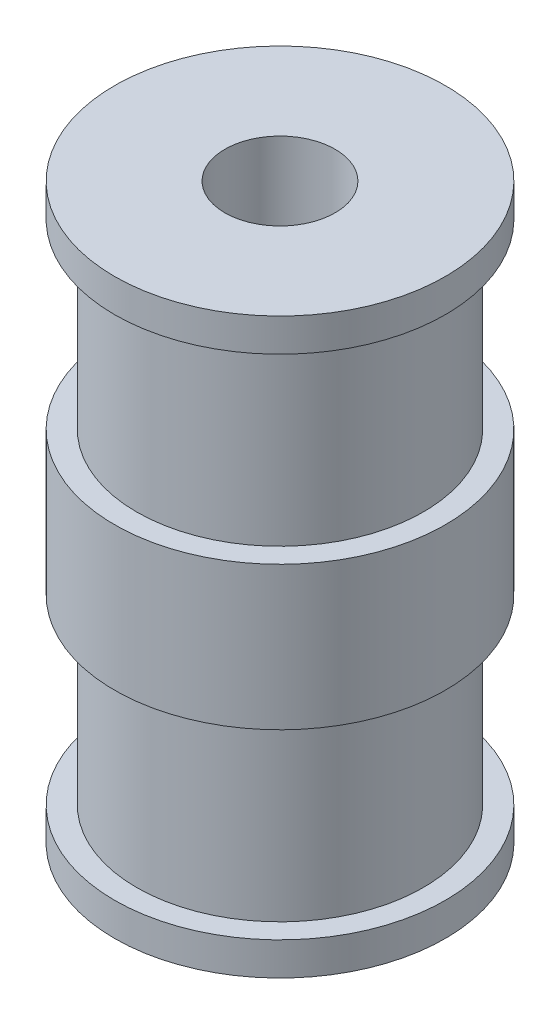
ISO-10303-21;
HEADER;
FILE_DESCRIPTION(('STEP AP214'),'2;1');
FILE_NAME('part.step','',(''),(''),'','','');
FILE_SCHEMA(('AUTOMOTIVE_DESIGN { 1 0 10303 214 1 1 1 1 }'));
ENDSEC;
DATA;
#1=APPLICATION_CONTEXT('core data for automotive mechanical design processes');
#2=APPLICATION_PROTOCOL_DEFINITION('international standard','automotive_design',2000,#1);
#3=PRODUCT_CONTEXT('',#1,'mechanical');
#4=PRODUCT('Part','Part','',(#3));
#5=PRODUCT_RELATED_PRODUCT_CATEGORY('part','',(#4));
#6=PRODUCT_DEFINITION_FORMATION('','',#4);
#7=PRODUCT_DEFINITION_CONTEXT('part definition',#1,'design');
#8=PRODUCT_DEFINITION('design','',#6,#7);
#9=PRODUCT_DEFINITION_SHAPE('','',#8);
#10=(LENGTH_UNIT() NAMED_UNIT(*) SI_UNIT(.MILLI.,.METRE.));
#11=(NAMED_UNIT(*) PLANE_ANGLE_UNIT() SI_UNIT($,.RADIAN.));
#12=(NAMED_UNIT(*) SI_UNIT($,.STERADIAN.) SOLID_ANGLE_UNIT());
#13=UNCERTAINTY_MEASURE_WITH_UNIT(LENGTH_MEASURE(1.E-05),#10,'distance_accuracy_value','');
#14=(GEOMETRIC_REPRESENTATION_CONTEXT(3) GLOBAL_UNCERTAINTY_ASSIGNED_CONTEXT((#13)) GLOBAL_UNIT_ASSIGNED_CONTEXT((#10,
#11,#12)) REPRESENTATION_CONTEXT('',''));
#15=CARTESIAN_POINT('',(0.,0.,0.));
#16=DIRECTION('',(0.,0.,1.));
#17=DIRECTION('',(1.,0.,0.));
#18=AXIS2_PLACEMENT_3D('',#15,#16,#17);
#19=CARTESIAN_POINT('',(0.,16.25,0.));
#20=DIRECTION('',(0.,1.,0.));
#21=DIRECTION('',(0.,0.,1.));
#22=AXIS2_PLACEMENT_3D('',#19,#20,#21);
#23=PLANE('',#22);
#24=CARTESIAN_POINT('',(0.,16.25,0.));
#25=DIRECTION('',(0.,1.,0.));
#26=DIRECTION('',(0.,0.,1.));
#27=AXIS2_PLACEMENT_3D('',#24,#25,#26);
#28=CIRCLE('',#27,7.5);
#29=CARTESIAN_POINT('',(0.,16.25,-7.5));
#30=VERTEX_POINT('',#29);
#31=EDGE_CURVE('E50',#30,#30,#28,.T.);
#32=ORIENTED_EDGE('',*,*,#31,.T.);
#33=EDGE_LOOP('',(#32));
#34=FACE_BOUND('',#33,.T.);
#35=CARTESIAN_POINT('',(0.,16.25,0.));
#36=DIRECTION('',(0.,1.,0.));
#37=DIRECTION('',(0.,0.,1.));
#38=AXIS2_PLACEMENT_3D('',#35,#36,#37);
#39=CIRCLE('',#38,6.5);
#40=CARTESIAN_POINT('',(0.,16.25,6.5));
#41=VERTEX_POINT('',#40);
#42=EDGE_CURVE('E59',#41,#41,#39,.T.);
#43=ORIENTED_EDGE('',*,*,#42,.F.);
#44=EDGE_LOOP('',(#43));
#45=FACE_BOUND('',#44,.T.);
#46=ADVANCED_FACE('F31',(#34,#45),#23,.T.);
#47=CARTESIAN_POINT('',(0.,1.5,0.));
#48=DIRECTION('',(0.,1.,0.));
#49=DIRECTION('',(0.,0.,1.));
#50=AXIS2_PLACEMENT_3D('',#47,#48,#49);
#51=PLANE('',#50);
#52=CARTESIAN_POINT('',(0.,1.5,0.));
#53=DIRECTION('',(0.,1.,0.));
#54=DIRECTION('',(0.,0.,1.));
#55=AXIS2_PLACEMENT_3D('',#52,#53,#54);
#56=CIRCLE('',#55,7.5);
#57=CARTESIAN_POINT('',(0.,1.5,7.5));
#58=VERTEX_POINT('',#57);
#59=EDGE_CURVE('E10',#58,#58,#56,.T.);
#60=ORIENTED_EDGE('',*,*,#59,.T.);
#61=EDGE_LOOP('',(#60));
#62=FACE_BOUND('',#61,.T.);
#63=CARTESIAN_POINT('',(0.,1.5,0.));
#64=DIRECTION('',(0.,1.,0.));
#65=DIRECTION('',(0.,0.,1.));
#66=AXIS2_PLACEMENT_3D('',#63,#64,#65);
#67=CIRCLE('',#66,6.5);
#68=CARTESIAN_POINT('',(0.,1.5,6.5));
#69=VERTEX_POINT('',#68);
#70=EDGE_CURVE('E47',#69,#69,#67,.T.);
#71=ORIENTED_EDGE('',*,*,#70,.F.);
#72=EDGE_LOOP('',(#71));
#73=FACE_BOUND('',#72,.T.);
#74=ADVANCED_FACE('F92',(#62,#73),#51,.T.);
#75=CARTESIAN_POINT('',(0.,0.,0.));
#76=DIRECTION('',(0.,1.,0.));
#77=DIRECTION('',(0.,0.,1.));
#78=AXIS2_PLACEMENT_3D('',#75,#76,#77);
#79=PLANE('',#78);
#80=CARTESIAN_POINT('',(0.,0.,0.));
#81=DIRECTION('',(0.,1.,0.));
#82=DIRECTION('',(0.,0.,1.));
#83=AXIS2_PLACEMENT_3D('',#80,#81,#82);
#84=CIRCLE('',#83,7.5);
#85=CARTESIAN_POINT('',(0.,0.,7.5));
#86=VERTEX_POINT('',#85);
#87=EDGE_CURVE('E35',#86,#86,#84,.T.);
#88=ORIENTED_EDGE('',*,*,#87,.F.);
#89=EDGE_LOOP('',(#88));
#90=FACE_BOUND('',#89,.T.);
#91=CARTESIAN_POINT('',(0.,0.,0.));
#92=DIRECTION('',(0.,1.,0.));
#93=DIRECTION('',(0.,0.,1.));
#94=AXIS2_PLACEMENT_3D('',#91,#92,#93);
#95=CIRCLE('',#94,2.5);
#96=CARTESIAN_POINT('',(0.,0.,2.5));
#97=VERTEX_POINT('',#96);
#98=EDGE_CURVE('E42',#97,#97,#95,.T.);
#99=ORIENTED_EDGE('',*,*,#98,.T.);
#100=EDGE_LOOP('',(#99));
#101=FACE_BOUND('',#100,.T.);
#102=ADVANCED_FACE('F98',(#90,#101),#79,.F.);
#103=CARTESIAN_POINT('',(0.,1.5,0.));
#104=DIRECTION('',(0.,-1.,0.));
#105=DIRECTION('',(0.,0.,-1.));
#106=AXIS2_PLACEMENT_3D('',#103,#104,#105);
#107=CYLINDRICAL_SURFACE('',#106,7.5);
#108=ORIENTED_EDGE('',*,*,#59,.F.);
#109=EDGE_LOOP('',(#108));
#110=FACE_BOUND('',#109,.T.);
#111=ORIENTED_EDGE('',*,*,#87,.T.);
#112=EDGE_LOOP('',(#111));
#113=FACE_BOUND('',#112,.T.);
#114=ADVANCED_FACE('F33',(#110,#113),#107,.T.);
#115=CARTESIAN_POINT('',(0.,1.5,0.));
#116=DIRECTION('',(0.,-1.,0.));
#117=DIRECTION('',(0.,0.,-1.));
#118=AXIS2_PLACEMENT_3D('',#115,#116,#117);
#119=CYLINDRICAL_SURFACE('',#118,2.5);
#120=ORIENTED_EDGE('',*,*,#98,.F.);
#121=EDGE_LOOP('',(#120));
#122=FACE_BOUND('',#121,.T.);
#123=CARTESIAN_POINT('',(0.,26.,0.));
#124=DIRECTION('',(0.,1.,0.));
#125=DIRECTION('',(0.,0.,1.));
#126=AXIS2_PLACEMENT_3D('',#123,#124,#125);
#127=CIRCLE('',#126,2.5);
#128=CARTESIAN_POINT('',(0.,26.,2.5));
#129=VERTEX_POINT('',#128);
#130=EDGE_CURVE('E68',#129,#129,#127,.T.);
#131=ORIENTED_EDGE('',*,*,#130,.T.);
#132=EDGE_LOOP('',(#131));
#133=FACE_BOUND('',#132,.T.);
#134=ADVANCED_FACE('F74',(#122,#133),#119,.F.);
#135=CARTESIAN_POINT('',(0.,9.75,0.));
#136=DIRECTION('',(0.,-1.,0.));
#137=DIRECTION('',(0.,0.,-1.));
#138=AXIS2_PLACEMENT_3D('',#135,#136,#137);
#139=CYLINDRICAL_SURFACE('',#138,6.5);
#140=CARTESIAN_POINT('',(0.,9.75,0.));
#141=DIRECTION('',(0.,1.,0.));
#142=DIRECTION('',(0.,0.,1.));
#143=AXIS2_PLACEMENT_3D('',#140,#141,#142);
#144=CIRCLE('',#143,6.5);
#145=CARTESIAN_POINT('',(0.,9.75,6.5));
#146=VERTEX_POINT('',#145);
#147=EDGE_CURVE('E46',#146,#146,#144,.T.);
#148=ORIENTED_EDGE('',*,*,#147,.F.);
#149=EDGE_LOOP('',(#148));
#150=FACE_BOUND('',#149,.T.);
#151=ORIENTED_EDGE('',*,*,#70,.T.);
#152=EDGE_LOOP('',(#151));
#153=FACE_BOUND('',#152,.T.);
#154=ADVANCED_FACE('F107',(#150,#153),#139,.T.);
#155=CARTESIAN_POINT('',(0.,9.75,0.));
#156=DIRECTION('',(0.,1.,0.));
#157=DIRECTION('',(0.,0.,1.));
#158=AXIS2_PLACEMENT_3D('',#155,#156,#157);
#159=PLANE('',#158);
#160=CARTESIAN_POINT('',(0.,9.75,0.));
#161=DIRECTION('',(0.,1.,0.));
#162=DIRECTION('',(0.,0.,1.));
#163=AXIS2_PLACEMENT_3D('',#160,#161,#162);
#164=CIRCLE('',#163,7.5);
#165=CARTESIAN_POINT('',(0.,9.75,-7.5));
#166=VERTEX_POINT('',#165);
#167=EDGE_CURVE('E53',#166,#166,#164,.T.);
#168=ORIENTED_EDGE('',*,*,#167,.F.);
#169=EDGE_LOOP('',(#168));
#170=FACE_BOUND('',#169,.T.);
#171=ORIENTED_EDGE('',*,*,#147,.T.);
#172=EDGE_LOOP('',(#171));
#173=FACE_BOUND('',#172,.T.);
#174=ADVANCED_FACE('F103',(#170,#173),#159,.F.);
#175=CARTESIAN_POINT('',(0.,16.25,0.));
#176=DIRECTION('',(0.,-1.,0.));
#177=DIRECTION('',(0.,0.,-1.));
#178=AXIS2_PLACEMENT_3D('',#175,#176,#177);
#179=CYLINDRICAL_SURFACE('',#178,7.5);
#180=CARTESIAN_POINT('',(0.,16.25,-7.5));
#181=CARTESIAN_POINT('',(0.,16.1822916666667,-7.5));
#182=CARTESIAN_POINT('',(0.,16.1145833333333,-7.5));
#183=CARTESIAN_POINT('',(0.,15.9791666666667,-7.5));
#184=CARTESIAN_POINT('',(0.,15.9114583333333,-7.5));
#185=CARTESIAN_POINT('',(0.,15.7760416666667,-7.5));
#186=CARTESIAN_POINT('',(0.,15.7083333333333,-7.5));
#187=CARTESIAN_POINT('',(0.,15.5729166666667,-7.5));
#188=CARTESIAN_POINT('',(0.,15.5052083333333,-7.5));
#189=CARTESIAN_POINT('',(0.,15.3697916666667,-7.5));
#190=CARTESIAN_POINT('',(0.,15.3020833333333,-7.5));
#191=CARTESIAN_POINT('',(0.,15.1666666666667,-7.5));
#192=CARTESIAN_POINT('',(0.,15.0989583333333,-7.5));
#193=CARTESIAN_POINT('',(0.,14.9635416666667,-7.5));
#194=CARTESIAN_POINT('',(0.,14.8958333333333,-7.5));
#195=CARTESIAN_POINT('',(0.,14.7604166666667,-7.5));
#196=CARTESIAN_POINT('',(0.,14.6927083333333,-7.5));
#197=CARTESIAN_POINT('',(0.,14.5572916666667,-7.5));
#198=CARTESIAN_POINT('',(0.,14.4895833333333,-7.5));
#199=CARTESIAN_POINT('',(0.,14.3541666666667,-7.5));
#200=CARTESIAN_POINT('',(0.,14.2864583333333,-7.5));
#201=CARTESIAN_POINT('',(0.,14.1510416666667,-7.5));
#202=CARTESIAN_POINT('',(0.,14.0833333333333,-7.5));
#203=CARTESIAN_POINT('',(0.,13.9479166666667,-7.5));
#204=CARTESIAN_POINT('',(0.,13.8802083333333,-7.5));
#205=CARTESIAN_POINT('',(0.,13.7447916666667,-7.5));
#206=CARTESIAN_POINT('',(0.,13.6770833333333,-7.5));
#207=CARTESIAN_POINT('',(0.,13.5416666666667,-7.5));
#208=CARTESIAN_POINT('',(0.,13.4739583333333,-7.5));
#209=CARTESIAN_POINT('',(0.,13.3385416666667,-7.5));
#210=CARTESIAN_POINT('',(0.,13.2708333333333,-7.5));
#211=CARTESIAN_POINT('',(0.,13.1354166666667,-7.5));
#212=CARTESIAN_POINT('',(0.,13.0677083333333,-7.5));
#213=CARTESIAN_POINT('',(0.,12.9322916666667,-7.5));
#214=CARTESIAN_POINT('',(0.,12.8645833333333,-7.5));
#215=CARTESIAN_POINT('',(0.,12.7291666666667,-7.5));
#216=CARTESIAN_POINT('',(0.,12.6614583333333,-7.5));
#217=CARTESIAN_POINT('',(0.,12.5260416666667,-7.5));
#218=CARTESIAN_POINT('',(0.,12.4583333333333,-7.5));
#219=CARTESIAN_POINT('',(0.,12.3229166666667,-7.5));
#220=CARTESIAN_POINT('',(0.,12.2552083333333,-7.5));
#221=CARTESIAN_POINT('',(0.,12.1197916666667,-7.5));
#222=CARTESIAN_POINT('',(0.,12.0520833333333,-7.5));
#223=CARTESIAN_POINT('',(0.,11.9166666666667,-7.5));
#224=CARTESIAN_POINT('',(0.,11.8489583333333,-7.5));
#225=CARTESIAN_POINT('',(0.,11.7135416666667,-7.5));
#226=CARTESIAN_POINT('',(0.,11.6458333333333,-7.5));
#227=CARTESIAN_POINT('',(0.,11.5104166666667,-7.5));
#228=CARTESIAN_POINT('',(0.,11.4427083333333,-7.5));
#229=CARTESIAN_POINT('',(0.,11.3072916666667,-7.5));
#230=CARTESIAN_POINT('',(0.,11.2395833333333,-7.5));
#231=CARTESIAN_POINT('',(0.,11.1041666666667,-7.5));
#232=CARTESIAN_POINT('',(0.,11.0364583333333,-7.5));
#233=CARTESIAN_POINT('',(0.,10.9010416666667,-7.5));
#234=CARTESIAN_POINT('',(0.,10.8333333333333,-7.5));
#235=CARTESIAN_POINT('',(0.,10.6979166666667,-7.5));
#236=CARTESIAN_POINT('',(0.,10.6302083333333,-7.5));
#237=CARTESIAN_POINT('',(0.,10.4947916666667,-7.5));
#238=CARTESIAN_POINT('',(0.,10.4270833333333,-7.5));
#239=CARTESIAN_POINT('',(0.,10.2916666666667,-7.5));
#240=CARTESIAN_POINT('',(0.,10.2239583333333,-7.5));
#241=CARTESIAN_POINT('',(0.,10.0885416666667,-7.5));
#242=CARTESIAN_POINT('',(0.,10.0208333333333,-7.5));
#243=CARTESIAN_POINT('',(0.,9.88541666666667,-7.5));
#244=CARTESIAN_POINT('',(0.,9.81770833333333,-7.5));
#245=CARTESIAN_POINT('',(0.,9.75,-7.5));
#246=B_SPLINE_CURVE_WITH_KNOTS('',3,(#180,#181,#182,#183,#184,#185,#186,#187,#188,#189,#190,
#191,#192,#193,#194,#195,#196,#197,#198,#199,#200,#201,#202,#203,#204,#205,#206,#207,#208,#209,
#210,#211,#212,#213,#214,#215,#216,#217,#218,#219,#220,#221,#222,#223,#224,#225,#226,#227,#228,
#229,#230,#231,#232,#233,#234,#235,#236,#237,#238,#239,#240,#241,#242,#243,#244,#245),
.UNSPECIFIED.,.F.,.F.,(4,2,2,2,2,2,2,2,2,2,2,2,2,2,2,2,2,2,2,2,2,2,2,2,2,2,2,2,2,2,2,2,4),(0.,
0.203124999999998,0.406249999999997,0.609374999999999,0.812499999999999,1.015625,1.21875,
1.421875,1.625,1.828125,2.03125,2.234375,2.4375,2.640625,2.84375,3.046875,3.25,3.453125,3.65625,
3.859375,4.0625,4.265625,4.46875,4.671875,4.875,5.078125,5.28125,5.484375,5.6875,5.890625,
6.09375,6.296875,6.5),.UNSPECIFIED.);
#247=EDGE_CURVE('BSEAM106',#30,#166,#246,.T.);
#248=ORIENTED_EDGE('',*,*,#31,.F.);
#249=ORIENTED_EDGE('',*,*,#167,.T.);
#250=ORIENTED_EDGE('',*,*,#247,.T.);
#251=ORIENTED_EDGE('',*,*,#247,.F.);
#252=EDGE_LOOP('',(#248,#250,#249,#251));
#253=FACE_BOUND('',#252,.T.);
#254=ADVANCED_FACE('F106',(#253),#179,.T.);
#255=CARTESIAN_POINT('',(0.,24.5,0.));
#256=DIRECTION('',(0.,-1.,0.));
#257=DIRECTION('',(0.,0.,-1.));
#258=AXIS2_PLACEMENT_3D('',#255,#256,#257);
#259=CYLINDRICAL_SURFACE('',#258,6.5);
#260=CARTESIAN_POINT('',(0.,24.5,0.));
#261=DIRECTION('',(0.,1.,0.));
#262=DIRECTION('',(0.,0.,1.));
#263=AXIS2_PLACEMENT_3D('',#260,#261,#262);
#264=CIRCLE('',#263,6.5);
#265=CARTESIAN_POINT('',(0.,24.5,6.5));
#266=VERTEX_POINT('',#265);
#267=EDGE_CURVE('E56',#266,#266,#264,.T.);
#268=ORIENTED_EDGE('',*,*,#267,.F.);
#269=EDGE_LOOP('',(#268));
#270=FACE_BOUND('',#269,.T.);
#271=ORIENTED_EDGE('',*,*,#42,.T.);
#272=EDGE_LOOP('',(#271));
#273=FACE_BOUND('',#272,.T.);
#274=ADVANCED_FACE('F88',(#270,#273),#259,.T.);
#275=CARTESIAN_POINT('',(0.,24.5,0.));
#276=DIRECTION('',(0.,1.,0.));
#277=DIRECTION('',(0.,0.,1.));
#278=AXIS2_PLACEMENT_3D('',#275,#276,#277);
#279=PLANE('',#278);
#280=CARTESIAN_POINT('',(0.,24.5,0.));
#281=DIRECTION('',(0.,1.,0.));
#282=DIRECTION('',(0.,0.,1.));
#283=AXIS2_PLACEMENT_3D('',#280,#281,#282);
#284=CIRCLE('',#283,7.5);
#285=CARTESIAN_POINT('',(0.,24.5,7.5));
#286=VERTEX_POINT('',#285);
#287=EDGE_CURVE('E65',#286,#286,#284,.T.);
#288=ORIENTED_EDGE('',*,*,#287,.F.);
#289=EDGE_LOOP('',(#288));
#290=FACE_BOUND('',#289,.T.);
#291=ORIENTED_EDGE('',*,*,#267,.T.);
#292=EDGE_LOOP('',(#291));
#293=FACE_BOUND('',#292,.T.);
#294=ADVANCED_FACE('F79',(#290,#293),#279,.F.);
#295=CARTESIAN_POINT('',(0.,26.,0.));
#296=DIRECTION('',(0.,1.,0.));
#297=DIRECTION('',(0.,0.,1.));
#298=AXIS2_PLACEMENT_3D('',#295,#296,#297);
#299=PLANE('',#298);
#300=CARTESIAN_POINT('',(0.,26.,0.));
#301=DIRECTION('',(0.,1.,0.));
#302=DIRECTION('',(0.,0.,1.));
#303=AXIS2_PLACEMENT_3D('',#300,#301,#302);
#304=CIRCLE('',#303,7.5);
#305=CARTESIAN_POINT('',(0.,26.,7.5));
#306=VERTEX_POINT('',#305);
#307=EDGE_CURVE('E62',#306,#306,#304,.T.);
#308=ORIENTED_EDGE('',*,*,#307,.T.);
#309=EDGE_LOOP('',(#308));
#310=FACE_BOUND('',#309,.T.);
#311=ORIENTED_EDGE('',*,*,#130,.F.);
#312=EDGE_LOOP('',(#311));
#313=FACE_BOUND('',#312,.T.);
#314=ADVANCED_FACE('F76',(#310,#313),#299,.T.);
#315=CARTESIAN_POINT('',(0.,26.,0.));
#316=DIRECTION('',(0.,-1.,0.));
#317=DIRECTION('',(0.,0.,-1.));
#318=AXIS2_PLACEMENT_3D('',#315,#316,#317);
#319=CYLINDRICAL_SURFACE('',#318,7.5);
#320=ORIENTED_EDGE('',*,*,#307,.F.);
#321=EDGE_LOOP('',(#320));
#322=FACE_BOUND('',#321,.T.);
#323=ORIENTED_EDGE('',*,*,#287,.T.);
#324=EDGE_LOOP('',(#323));
#325=FACE_BOUND('',#324,.T.);
#326=ADVANCED_FACE('F78',(#322,#325),#319,.T.);
#327=CLOSED_SHELL('',(#46,#74,#102,#114,#134,#154,#174,#254,#274,#294,#314,#326));
#328=MANIFOLD_SOLID_BREP('B2',#327);
#329=ADVANCED_BREP_SHAPE_REPRESENTATION('',(#18,#328),#14);
#330=SHAPE_DEFINITION_REPRESENTATION(#9,#329);
ENDSEC;
END-ISO-10303-21;
